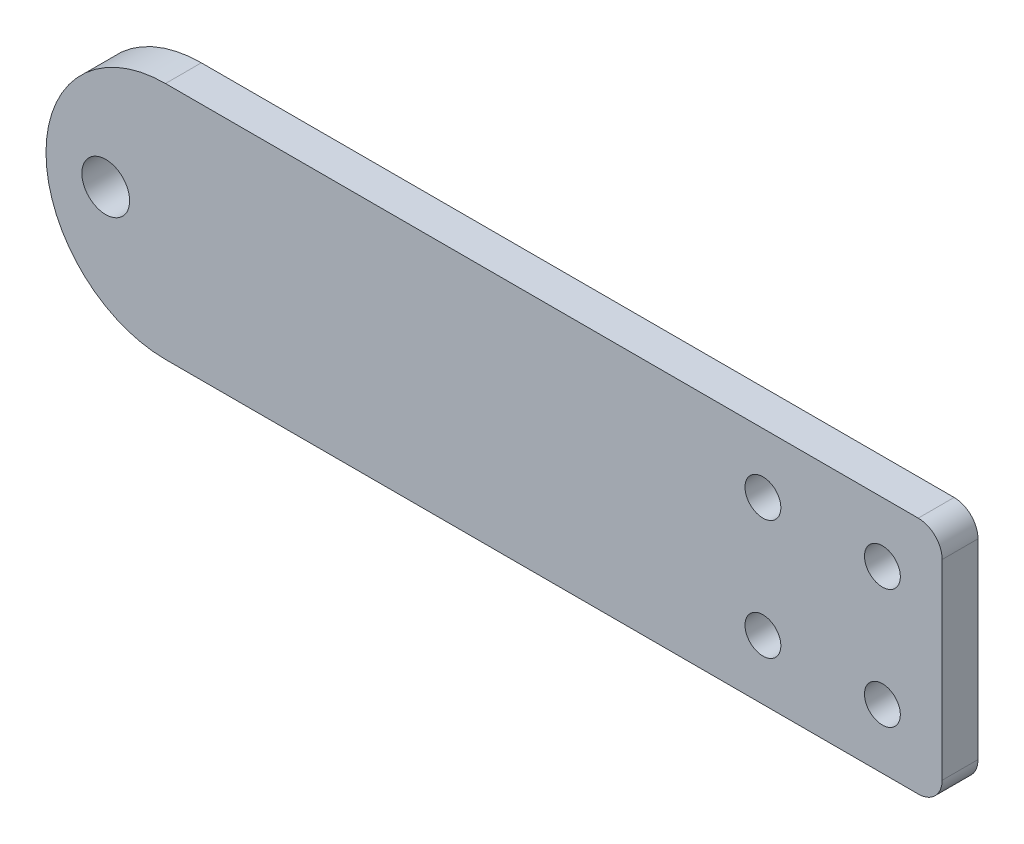
ISO-10303-21;
HEADER;
FILE_DESCRIPTION(('STEP AP214'),'2;1');
FILE_NAME('part.step','',(''),(''),'','','');
FILE_SCHEMA(('AUTOMOTIVE_DESIGN { 1 0 10303 214 1 1 1 1 }'));
ENDSEC;
DATA;
#1=APPLICATION_CONTEXT('core data for automotive mechanical design processes');
#2=APPLICATION_PROTOCOL_DEFINITION('international standard','automotive_design',2000,#1);
#3=PRODUCT_CONTEXT('',#1,'mechanical');
#4=PRODUCT('Part','Part','',(#3));
#5=PRODUCT_RELATED_PRODUCT_CATEGORY('part','',(#4));
#6=PRODUCT_DEFINITION_FORMATION('','',#4);
#7=PRODUCT_DEFINITION_CONTEXT('part definition',#1,'design');
#8=PRODUCT_DEFINITION('design','',#6,#7);
#9=PRODUCT_DEFINITION_SHAPE('','',#8);
#10=(LENGTH_UNIT() NAMED_UNIT(*) SI_UNIT(.MILLI.,.METRE.));
#11=(NAMED_UNIT(*) PLANE_ANGLE_UNIT() SI_UNIT($,.RADIAN.));
#12=(NAMED_UNIT(*) SI_UNIT($,.STERADIAN.) SOLID_ANGLE_UNIT());
#13=UNCERTAINTY_MEASURE_WITH_UNIT(LENGTH_MEASURE(1.E-05),#10,'distance_accuracy_value','');
#14=(GEOMETRIC_REPRESENTATION_CONTEXT(3) GLOBAL_UNCERTAINTY_ASSIGNED_CONTEXT((#13)) GLOBAL_UNIT_ASSIGNED_CONTEXT((#10,
#11,#12)) REPRESENTATION_CONTEXT('',''));
#15=CARTESIAN_POINT('',(0.,0.,0.));
#16=DIRECTION('',(0.,0.,1.));
#17=DIRECTION('',(1.,0.,0.));
#18=AXIS2_PLACEMENT_3D('',#15,#16,#17);
#19=CARTESIAN_POINT('',(0.,0.,3.));
#20=DIRECTION('',(0.,1.,0.));
#21=DIRECTION('',(0.,0.,1.));
#22=AXIS2_PLACEMENT_3D('',#19,#20,#21);
#23=PLANE('',#22);
#24=DIRECTION('',(1.,0.,0.));
#25=VECTOR('',#24,1.);
#26=CARTESIAN_POINT('',(0.,0.,0.));
#27=LINE('',#26,#25);
#28=CARTESIAN_POINT('',(10.,0.,0.));
#29=VERTEX_POINT('',#28);
#30=CARTESIAN_POINT('',(73.,0.,0.));
#31=VERTEX_POINT('',#30);
#32=EDGE_CURVE('E117',#29,#31,#27,.T.);
#33=ORIENTED_EDGE('',*,*,#32,.T.);
#34=DIRECTION('',(0.,0.,-1.));
#35=VECTOR('',#34,1.);
#36=CARTESIAN_POINT('',(73.,0.,3.));
#37=LINE('',#36,#35);
#38=CARTESIAN_POINT('',(73.,0.,3.));
#39=VERTEX_POINT('',#38);
#40=EDGE_CURVE('E63',#31,#39,#37,.F.);
#41=ORIENTED_EDGE('',*,*,#40,.T.);
#42=DIRECTION('',(1.,0.,0.));
#43=VECTOR('',#42,1.);
#44=CARTESIAN_POINT('',(0.,0.,3.));
#45=LINE('',#44,#43);
#46=CARTESIAN_POINT('',(10.,0.,3.));
#47=VERTEX_POINT('',#46);
#48=EDGE_CURVE('E118',#47,#39,#45,.T.);
#49=ORIENTED_EDGE('',*,*,#48,.F.);
#50=DIRECTION('',(0.,0.,-1.));
#51=VECTOR('',#50,1.);
#52=CARTESIAN_POINT('',(10.,0.,3.));
#53=LINE('',#52,#51);
#54=EDGE_CURVE('E106',#47,#29,#53,.T.);
#55=ORIENTED_EDGE('',*,*,#54,.T.);
#56=EDGE_LOOP('',(#33,#41,#49,#55));
#57=FACE_BOUND('',#56,.T.);
#58=ADVANCED_FACE('F39',(#57),#23,.F.);
#59=CARTESIAN_POINT('',(75.,0.,3.));
#60=DIRECTION('',(-1.,0.,0.));
#61=DIRECTION('',(0.,0.,1.));
#62=AXIS2_PLACEMENT_3D('',#59,#60,#61);
#63=PLANE('',#62);
#64=DIRECTION('',(0.,1.,0.));
#65=VECTOR('',#64,1.);
#66=CARTESIAN_POINT('',(75.,0.,3.));
#67=LINE('',#66,#65);
#68=CARTESIAN_POINT('',(75.,2.,3.));
#69=VERTEX_POINT('',#68);
#70=CARTESIAN_POINT('',(75.,18.,3.));
#71=VERTEX_POINT('',#70);
#72=EDGE_CURVE('E192',#69,#71,#67,.T.);
#73=ORIENTED_EDGE('',*,*,#72,.F.);
#74=DIRECTION('',(0.,0.,-1.));
#75=VECTOR('',#74,1.);
#76=CARTESIAN_POINT('',(75.,2.,3.));
#77=LINE('',#76,#75);
#78=CARTESIAN_POINT('',(75.,2.,0.));
#79=VERTEX_POINT('',#78);
#80=EDGE_CURVE('E176',#69,#79,#77,.T.);
#81=ORIENTED_EDGE('',*,*,#80,.T.);
#82=DIRECTION('',(0.,1.,0.));
#83=VECTOR('',#82,1.);
#84=CARTESIAN_POINT('',(75.,0.,0.));
#85=LINE('',#84,#83);
#86=CARTESIAN_POINT('',(75.,18.,0.));
#87=VERTEX_POINT('',#86);
#88=EDGE_CURVE('E126',#79,#87,#85,.T.);
#89=ORIENTED_EDGE('',*,*,#88,.T.);
#90=DIRECTION('',(0.,0.,-1.));
#91=VECTOR('',#90,1.);
#92=CARTESIAN_POINT('',(75.,18.,3.));
#93=LINE('',#92,#91);
#94=EDGE_CURVE('E170',#87,#71,#93,.F.);
#95=ORIENTED_EDGE('',*,*,#94,.T.);
#96=EDGE_LOOP('',(#73,#81,#89,#95));
#97=FACE_BOUND('',#96,.T.);
#98=ADVANCED_FACE('F196',(#97),#63,.F.);
#99=CARTESIAN_POINT('',(75.,20.,3.));
#100=DIRECTION('',(0.,-1.,0.));
#101=DIRECTION('',(1.,0.,0.));
#102=AXIS2_PLACEMENT_3D('',#99,#100,#101);
#103=PLANE('',#102);
#104=DIRECTION('',(-1.,0.,0.));
#105=VECTOR('',#104,1.);
#106=CARTESIAN_POINT('',(75.,20.,3.));
#107=LINE('',#106,#105);
#108=CARTESIAN_POINT('',(73.,20.,3.));
#109=VERTEX_POINT('',#108);
#110=CARTESIAN_POINT('',(9.99999999999999,20.,3.));
#111=VERTEX_POINT('',#110);
#112=EDGE_CURVE('E120',#109,#111,#107,.T.);
#113=ORIENTED_EDGE('',*,*,#112,.F.);
#114=DIRECTION('',(0.,0.,-1.));
#115=VECTOR('',#114,1.);
#116=CARTESIAN_POINT('',(73.,20.,3.));
#117=LINE('',#116,#115);
#118=CARTESIAN_POINT('',(73.,20.,0.));
#119=VERTEX_POINT('',#118);
#120=EDGE_CURVE('E11',#109,#119,#117,.T.);
#121=ORIENTED_EDGE('',*,*,#120,.T.);
#122=DIRECTION('',(-1.,0.,0.));
#123=VECTOR('',#122,1.);
#124=CARTESIAN_POINT('',(75.,20.,0.));
#125=LINE('',#124,#123);
#126=CARTESIAN_POINT('',(9.99999999999999,20.,0.));
#127=VERTEX_POINT('',#126);
#128=EDGE_CURVE('E132',#119,#127,#125,.T.);
#129=ORIENTED_EDGE('',*,*,#128,.T.);
#130=DIRECTION('',(0.,0.,-1.));
#131=VECTOR('',#130,1.);
#132=CARTESIAN_POINT('',(9.99999999999999,20.,3.));
#133=LINE('',#132,#131);
#134=EDGE_CURVE('E166',#127,#111,#133,.F.);
#135=ORIENTED_EDGE('',*,*,#134,.T.);
#136=EDGE_LOOP('',(#113,#121,#129,#135));
#137=FACE_BOUND('',#136,.T.);
#138=ADVANCED_FACE('F214',(#137),#103,.F.);
#139=CARTESIAN_POINT('',(0.,0.,3.));
#140=DIRECTION('',(0.,0.,1.));
#141=DIRECTION('',(1.,0.,0.));
#142=AXIS2_PLACEMENT_3D('',#139,#140,#141);
#143=PLANE('',#142);
#144=CARTESIAN_POINT('',(5.,10.,3.));
#145=DIRECTION('',(0.,0.,1.));
#146=DIRECTION('',(1.,0.,0.));
#147=AXIS2_PLACEMENT_3D('',#144,#145,#146);
#148=CIRCLE('',#147,2.);
#149=CARTESIAN_POINT('',(7.,10.,3.));
#150=VERTEX_POINT('',#149);
#151=EDGE_CURVE('E173',#150,#150,#148,.T.);
#152=ORIENTED_EDGE('',*,*,#151,.F.);
#153=EDGE_LOOP('',(#152));
#154=FACE_BOUND('',#153,.T.);
#155=CARTESIAN_POINT('',(60.,5.00000000000001,3.));
#156=DIRECTION('',(0.,0.,1.));
#157=DIRECTION('',(1.,0.,0.));
#158=AXIS2_PLACEMENT_3D('',#155,#156,#157);
#159=CIRCLE('',#158,1.5);
#160=CARTESIAN_POINT('',(61.5,5.00000000000001,3.));
#161=VERTEX_POINT('',#160);
#162=EDGE_CURVE('E261',#161,#161,#159,.T.);
#163=ORIENTED_EDGE('',*,*,#162,.F.);
#164=EDGE_LOOP('',(#163));
#165=FACE_BOUND('',#164,.T.);
#166=CARTESIAN_POINT('',(60.,15.,3.));
#167=DIRECTION('',(0.,0.,1.));
#168=DIRECTION('',(1.,0.,0.));
#169=AXIS2_PLACEMENT_3D('',#166,#167,#168);
#170=CIRCLE('',#169,1.5);
#171=CARTESIAN_POINT('',(61.5,15.,3.));
#172=VERTEX_POINT('',#171);
#173=EDGE_CURVE('E275',#172,#172,#170,.T.);
#174=ORIENTED_EDGE('',*,*,#173,.F.);
#175=EDGE_LOOP('',(#174));
#176=FACE_BOUND('',#175,.T.);
#177=CARTESIAN_POINT('',(70.,5.00000000000001,3.));
#178=DIRECTION('',(0.,0.,1.));
#179=DIRECTION('',(1.,0.,0.));
#180=AXIS2_PLACEMENT_3D('',#177,#178,#179);
#181=CIRCLE('',#180,1.5);
#182=CARTESIAN_POINT('',(71.5,5.00000000000001,3.));
#183=VERTEX_POINT('',#182);
#184=EDGE_CURVE('E147',#183,#183,#181,.T.);
#185=ORIENTED_EDGE('',*,*,#184,.F.);
#186=EDGE_LOOP('',(#185));
#187=FACE_BOUND('',#186,.T.);
#188=CARTESIAN_POINT('',(70.,15.,3.));
#189=DIRECTION('',(0.,0.,1.));
#190=DIRECTION('',(1.,0.,0.));
#191=AXIS2_PLACEMENT_3D('',#188,#189,#190);
#192=CIRCLE('',#191,1.5);
#193=CARTESIAN_POINT('',(71.5,15.,3.));
#194=VERTEX_POINT('',#193);
#195=EDGE_CURVE('E135',#194,#194,#192,.T.);
#196=ORIENTED_EDGE('',*,*,#195,.F.);
#197=EDGE_LOOP('',(#196));
#198=FACE_BOUND('',#197,.T.);
#199=ORIENTED_EDGE('',*,*,#48,.T.);
#200=CARTESIAN_POINT('',(73.,2.,3.));
#201=DIRECTION('',(0.,0.,1.));
#202=DIRECTION('',(1.,0.,0.));
#203=AXIS2_PLACEMENT_3D('',#200,#201,#202);
#204=CIRCLE('',#203,2.);
#205=EDGE_CURVE('E48',#39,#69,#204,.T.);
#206=ORIENTED_EDGE('',*,*,#205,.T.);
#207=ORIENTED_EDGE('',*,*,#72,.T.);
#208=CARTESIAN_POINT('',(73.,18.,3.));
#209=DIRECTION('',(0.,0.,1.));
#210=DIRECTION('',(1.,0.,0.));
#211=AXIS2_PLACEMENT_3D('',#208,#209,#210);
#212=CIRCLE('',#211,2.);
#213=EDGE_CURVE('E55',#71,#109,#212,.T.);
#214=ORIENTED_EDGE('',*,*,#213,.T.);
#215=ORIENTED_EDGE('',*,*,#112,.T.);
#216=CARTESIAN_POINT('',(10.,10.,3.));
#217=DIRECTION('',(0.,0.,1.));
#218=DIRECTION('',(1.,0.,0.));
#219=AXIS2_PLACEMENT_3D('',#216,#217,#218);
#220=CIRCLE('',#219,10.);
#221=CARTESIAN_POINT('',(0.,10.,3.));
#222=VERTEX_POINT('',#221);
#223=EDGE_CURVE('E114',#111,#222,#220,.T.);
#224=ORIENTED_EDGE('',*,*,#223,.T.);
#225=CARTESIAN_POINT('',(10.,10.,3.));
#226=DIRECTION('',(0.,0.,1.));
#227=DIRECTION('',(1.,0.,0.));
#228=AXIS2_PLACEMENT_3D('',#225,#226,#227);
#229=CIRCLE('',#228,10.);
#230=EDGE_CURVE('E163',#222,#47,#229,.T.);
#231=ORIENTED_EDGE('',*,*,#230,.T.);
#232=EDGE_LOOP('',(#199,#206,#207,#214,#215,#224,#231));
#233=FACE_BOUND('',#232,.T.);
#234=ADVANCED_FACE('F191',(#154,#165,#176,#187,#198,#233),#143,.T.);
#235=CARTESIAN_POINT('',(0.,0.,0.));
#236=DIRECTION('',(0.,0.,1.));
#237=DIRECTION('',(1.,0.,0.));
#238=AXIS2_PLACEMENT_3D('',#235,#236,#237);
#239=PLANE('',#238);
#240=CARTESIAN_POINT('',(5.,10.,0.));
#241=DIRECTION('',(0.,0.,1.));
#242=DIRECTION('',(1.,0.,0.));
#243=AXIS2_PLACEMENT_3D('',#240,#241,#242);
#244=CIRCLE('',#243,2.);
#245=CARTESIAN_POINT('',(7.,10.,0.));
#246=VERTEX_POINT('',#245);
#247=EDGE_CURVE('E155',#246,#246,#244,.T.);
#248=ORIENTED_EDGE('',*,*,#247,.T.);
#249=EDGE_LOOP('',(#248));
#250=FACE_BOUND('',#249,.T.);
#251=CARTESIAN_POINT('',(60.,5.00000000000001,0.));
#252=DIRECTION('',(0.,0.,1.));
#253=DIRECTION('',(1.,0.,0.));
#254=AXIS2_PLACEMENT_3D('',#251,#252,#253);
#255=CIRCLE('',#254,1.5);
#256=CARTESIAN_POINT('',(61.5,5.00000000000001,0.));
#257=VERTEX_POINT('',#256);
#258=EDGE_CURVE('E151',#257,#257,#255,.T.);
#259=ORIENTED_EDGE('',*,*,#258,.T.);
#260=EDGE_LOOP('',(#259));
#261=FACE_BOUND('',#260,.T.);
#262=CARTESIAN_POINT('',(60.,15.,0.));
#263=DIRECTION('',(0.,0.,1.));
#264=DIRECTION('',(1.,0.,0.));
#265=AXIS2_PLACEMENT_3D('',#262,#263,#264);
#266=CIRCLE('',#265,1.5);
#267=CARTESIAN_POINT('',(61.5,15.,0.));
#268=VERTEX_POINT('',#267);
#269=EDGE_CURVE('E146',#268,#268,#266,.T.);
#270=ORIENTED_EDGE('',*,*,#269,.T.);
#271=EDGE_LOOP('',(#270));
#272=FACE_BOUND('',#271,.T.);
#273=CARTESIAN_POINT('',(70.,5.00000000000001,0.));
#274=DIRECTION('',(0.,0.,1.));
#275=DIRECTION('',(1.,0.,0.));
#276=AXIS2_PLACEMENT_3D('',#273,#274,#275);
#277=CIRCLE('',#276,1.5);
#278=CARTESIAN_POINT('',(71.5,5.00000000000001,0.));
#279=VERTEX_POINT('',#278);
#280=EDGE_CURVE('E142',#279,#279,#277,.T.);
#281=ORIENTED_EDGE('',*,*,#280,.T.);
#282=EDGE_LOOP('',(#281));
#283=FACE_BOUND('',#282,.T.);
#284=CARTESIAN_POINT('',(70.,15.,0.));
#285=DIRECTION('',(0.,0.,1.));
#286=DIRECTION('',(1.,0.,0.));
#287=AXIS2_PLACEMENT_3D('',#284,#285,#286);
#288=CIRCLE('',#287,1.5);
#289=CARTESIAN_POINT('',(71.5,15.,0.));
#290=VERTEX_POINT('',#289);
#291=EDGE_CURVE('E127',#290,#290,#288,.T.);
#292=ORIENTED_EDGE('',*,*,#291,.T.);
#293=EDGE_LOOP('',(#292));
#294=FACE_BOUND('',#293,.T.);
#295=ORIENTED_EDGE('',*,*,#88,.F.);
#296=CARTESIAN_POINT('',(73.,2.,0.));
#297=DIRECTION('',(0.,0.,1.));
#298=DIRECTION('',(1.,0.,0.));
#299=AXIS2_PLACEMENT_3D('',#296,#297,#298);
#300=CIRCLE('',#299,2.);
#301=EDGE_CURVE('E124',#79,#31,#300,.F.);
#302=ORIENTED_EDGE('',*,*,#301,.T.);
#303=ORIENTED_EDGE('',*,*,#32,.F.);
#304=CARTESIAN_POINT('',(10.,10.,0.));
#305=DIRECTION('',(0.,0.,1.));
#306=DIRECTION('',(1.,0.,0.));
#307=AXIS2_PLACEMENT_3D('',#304,#305,#306);
#308=CIRCLE('',#307,10.);
#309=CARTESIAN_POINT('',(0.,10.,0.));
#310=VERTEX_POINT('',#309);
#311=EDGE_CURVE('E102',#29,#310,#308,.F.);
#312=ORIENTED_EDGE('',*,*,#311,.T.);
#313=CARTESIAN_POINT('',(10.,10.,0.));
#314=DIRECTION('',(0.,0.,1.));
#315=DIRECTION('',(1.,0.,0.));
#316=AXIS2_PLACEMENT_3D('',#313,#314,#315);
#317=CIRCLE('',#316,10.);
#318=EDGE_CURVE('E115',#310,#127,#317,.F.);
#319=ORIENTED_EDGE('',*,*,#318,.T.);
#320=ORIENTED_EDGE('',*,*,#128,.F.);
#321=CARTESIAN_POINT('',(73.,18.,0.));
#322=DIRECTION('',(0.,0.,1.));
#323=DIRECTION('',(1.,0.,0.));
#324=AXIS2_PLACEMENT_3D('',#321,#322,#323);
#325=CIRCLE('',#324,2.);
#326=EDGE_CURVE('E180',#119,#87,#325,.F.);
#327=ORIENTED_EDGE('',*,*,#326,.T.);
#328=EDGE_LOOP('',(#295,#302,#303,#312,#319,#320,#327));
#329=FACE_BOUND('',#328,.T.);
#330=ADVANCED_FACE('F123',(#250,#261,#272,#283,#294,#329),#239,.F.);
#331=CARTESIAN_POINT('',(70.,15.,-1.));
#332=DIRECTION('',(0.,0.,1.));
#333=DIRECTION('',(1.,0.,0.));
#334=AXIS2_PLACEMENT_3D('',#331,#332,#333);
#335=CYLINDRICAL_SURFACE('',#334,1.5);
#336=ORIENTED_EDGE('',*,*,#195,.T.);
#337=EDGE_LOOP('',(#336));
#338=FACE_BOUND('',#337,.T.);
#339=ORIENTED_EDGE('',*,*,#291,.F.);
#340=EDGE_LOOP('',(#339));
#341=FACE_BOUND('',#340,.T.);
#342=ADVANCED_FACE('F240',(#338,#341),#335,.F.);
#343=CARTESIAN_POINT('',(70.,5.00000000000001,-1.));
#344=DIRECTION('',(0.,0.,1.));
#345=DIRECTION('',(1.,0.,0.));
#346=AXIS2_PLACEMENT_3D('',#343,#344,#345);
#347=CYLINDRICAL_SURFACE('',#346,1.5);
#348=ORIENTED_EDGE('',*,*,#184,.T.);
#349=EDGE_LOOP('',(#348));
#350=FACE_BOUND('',#349,.T.);
#351=ORIENTED_EDGE('',*,*,#280,.F.);
#352=EDGE_LOOP('',(#351));
#353=FACE_BOUND('',#352,.T.);
#354=ADVANCED_FACE('F245',(#350,#353),#347,.F.);
#355=CARTESIAN_POINT('',(60.,15.,-1.));
#356=DIRECTION('',(0.,0.,1.));
#357=DIRECTION('',(1.,0.,0.));
#358=AXIS2_PLACEMENT_3D('',#355,#356,#357);
#359=CYLINDRICAL_SURFACE('',#358,1.5);
#360=ORIENTED_EDGE('',*,*,#173,.T.);
#361=EDGE_LOOP('',(#360));
#362=FACE_BOUND('',#361,.T.);
#363=ORIENTED_EDGE('',*,*,#269,.F.);
#364=EDGE_LOOP('',(#363));
#365=FACE_BOUND('',#364,.T.);
#366=ADVANCED_FACE('F247',(#362,#365),#359,.F.);
#367=CARTESIAN_POINT('',(60.,5.00000000000001,-1.));
#368=DIRECTION('',(0.,0.,1.));
#369=DIRECTION('',(1.,0.,0.));
#370=AXIS2_PLACEMENT_3D('',#367,#368,#369);
#371=CYLINDRICAL_SURFACE('',#370,1.5);
#372=ORIENTED_EDGE('',*,*,#162,.T.);
#373=EDGE_LOOP('',(#372));
#374=FACE_BOUND('',#373,.T.);
#375=ORIENTED_EDGE('',*,*,#258,.F.);
#376=EDGE_LOOP('',(#375));
#377=FACE_BOUND('',#376,.T.);
#378=ADVANCED_FACE('F223',(#374,#377),#371,.F.);
#379=CARTESIAN_POINT('',(5.,10.,-1.));
#380=DIRECTION('',(0.,0.,1.));
#381=DIRECTION('',(1.,0.,0.));
#382=AXIS2_PLACEMENT_3D('',#379,#380,#381);
#383=CYLINDRICAL_SURFACE('',#382,2.);
#384=ORIENTED_EDGE('',*,*,#151,.T.);
#385=EDGE_LOOP('',(#384));
#386=FACE_BOUND('',#385,.T.);
#387=ORIENTED_EDGE('',*,*,#247,.F.);
#388=EDGE_LOOP('',(#387));
#389=FACE_BOUND('',#388,.T.);
#390=ADVANCED_FACE('F218',(#386,#389),#383,.F.);
#391=CARTESIAN_POINT('',(10.,10.,3.));
#392=DIRECTION('',(0.,0.,-1.));
#393=DIRECTION('',(-1.,0.,0.));
#394=AXIS2_PLACEMENT_3D('',#391,#392,#393);
#395=CYLINDRICAL_SURFACE('',#394,10.);
#396=DIRECTION('',(0.,0.,-1.));
#397=VECTOR('',#396,1.);
#398=CARTESIAN_POINT('',(0.,10.,3.));
#399=LINE('',#398,#397);
#400=EDGE_CURVE('E108',#222,#310,#399,.T.);
#401=ORIENTED_EDGE('',*,*,#400,.F.);
#402=ORIENTED_EDGE('',*,*,#223,.F.);
#403=ORIENTED_EDGE('',*,*,#134,.F.);
#404=ORIENTED_EDGE('',*,*,#318,.F.);
#405=EDGE_LOOP('',(#401,#402,#403,#404));
#406=FACE_BOUND('',#405,.T.);
#407=ADVANCED_FACE('F206',(#406),#395,.T.);
#408=CARTESIAN_POINT('',(10.,10.,3.));
#409=DIRECTION('',(0.,0.,-1.));
#410=DIRECTION('',(-1.,0.,0.));
#411=AXIS2_PLACEMENT_3D('',#408,#409,#410);
#412=CYLINDRICAL_SURFACE('',#411,10.);
#413=ORIENTED_EDGE('',*,*,#230,.F.);
#414=ORIENTED_EDGE('',*,*,#400,.T.);
#415=ORIENTED_EDGE('',*,*,#311,.F.);
#416=ORIENTED_EDGE('',*,*,#54,.F.);
#417=EDGE_LOOP('',(#413,#414,#415,#416));
#418=FACE_BOUND('',#417,.T.);
#419=ADVANCED_FACE('F105',(#418),#412,.T.);
#420=CARTESIAN_POINT('',(73.,2.,3.));
#421=DIRECTION('',(0.,0.,-1.));
#422=DIRECTION('',(-1.,0.,0.));
#423=AXIS2_PLACEMENT_3D('',#420,#421,#422);
#424=CYLINDRICAL_SURFACE('',#423,2.);
#425=ORIENTED_EDGE('',*,*,#205,.F.);
#426=ORIENTED_EDGE('',*,*,#40,.F.);
#427=ORIENTED_EDGE('',*,*,#301,.F.);
#428=ORIENTED_EDGE('',*,*,#80,.F.);
#429=EDGE_LOOP('',(#425,#426,#427,#428));
#430=FACE_BOUND('',#429,.T.);
#431=ADVANCED_FACE('F199',(#430),#424,.T.);
#432=CARTESIAN_POINT('',(73.,18.,3.));
#433=DIRECTION('',(0.,0.,-1.));
#434=DIRECTION('',(-1.,0.,0.));
#435=AXIS2_PLACEMENT_3D('',#432,#433,#434);
#436=CYLINDRICAL_SURFACE('',#435,2.);
#437=ORIENTED_EDGE('',*,*,#213,.F.);
#438=ORIENTED_EDGE('',*,*,#94,.F.);
#439=ORIENTED_EDGE('',*,*,#326,.F.);
#440=ORIENTED_EDGE('',*,*,#120,.F.);
#441=EDGE_LOOP('',(#437,#438,#439,#440));
#442=FACE_BOUND('',#441,.T.);
#443=ADVANCED_FACE('F41',(#442),#436,.T.);
#444=CLOSED_SHELL('',(#58,#98,#138,#234,#330,#342,#354,#366,#378,#390,#407,#419,#431,#443));
#445=MANIFOLD_SOLID_BREP('B2',#444);
#446=ADVANCED_BREP_SHAPE_REPRESENTATION('',(#18,#445),#14);
#447=SHAPE_DEFINITION_REPRESENTATION(#9,#446);
ENDSEC;
END-ISO-10303-21;
